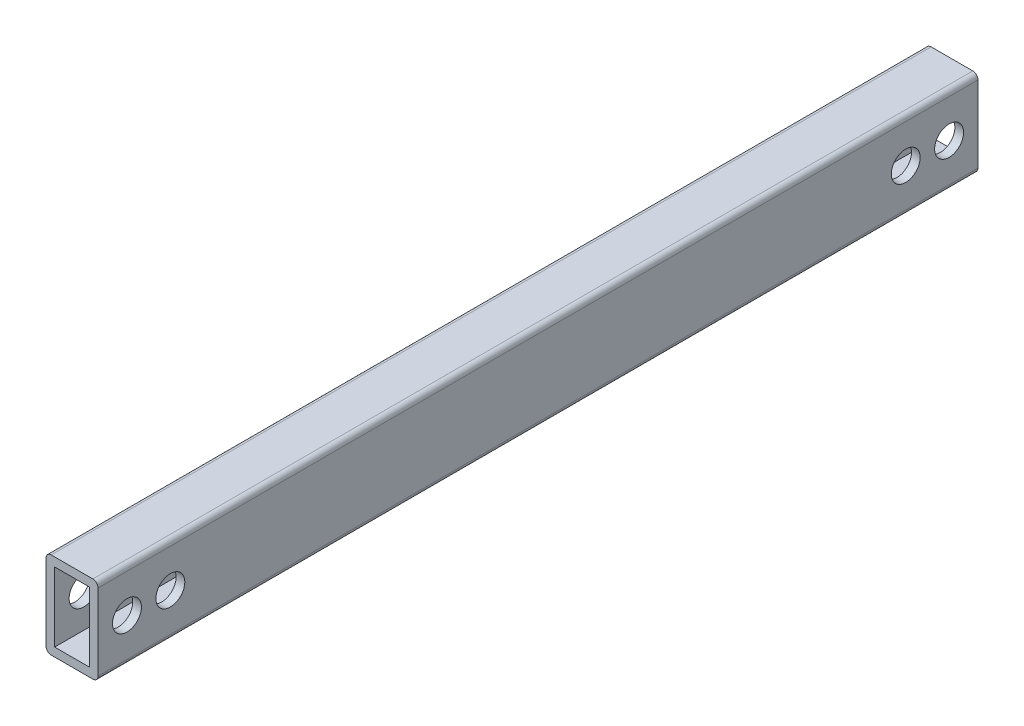
ISO-10303-21;
HEADER;
FILE_DESCRIPTION(('STEP AP214'),'2;1');
FILE_NAME('part.step','',(''),(''),'','','');
FILE_SCHEMA(('AUTOMOTIVE_DESIGN { 1 0 10303 214 1 1 1 1 }'));
ENDSEC;
DATA;
#1=APPLICATION_CONTEXT('core data for automotive mechanical design processes');
#2=APPLICATION_PROTOCOL_DEFINITION('international standard','automotive_design',2000,#1);
#3=PRODUCT_CONTEXT('',#1,'mechanical');
#4=PRODUCT('Part','Part','',(#3));
#5=PRODUCT_RELATED_PRODUCT_CATEGORY('part','',(#4));
#6=PRODUCT_DEFINITION_FORMATION('','',#4);
#7=PRODUCT_DEFINITION_CONTEXT('part definition',#1,'design');
#8=PRODUCT_DEFINITION('design','',#6,#7);
#9=PRODUCT_DEFINITION_SHAPE('','',#8);
#10=(LENGTH_UNIT() NAMED_UNIT(*) SI_UNIT(.MILLI.,.METRE.));
#11=(NAMED_UNIT(*) PLANE_ANGLE_UNIT() SI_UNIT($,.RADIAN.));
#12=(NAMED_UNIT(*) SI_UNIT($,.STERADIAN.) SOLID_ANGLE_UNIT());
#13=UNCERTAINTY_MEASURE_WITH_UNIT(LENGTH_MEASURE(1.E-05),#10,'distance_accuracy_value','');
#14=(GEOMETRIC_REPRESENTATION_CONTEXT(3) GLOBAL_UNCERTAINTY_ASSIGNED_CONTEXT((#13)) GLOBAL_UNIT_ASSIGNED_CONTEXT((#10,
#11,#12)) REPRESENTATION_CONTEXT('',''));
#15=CARTESIAN_POINT('',(0.,0.,0.));
#16=DIRECTION('',(0.,0.,1.));
#17=DIRECTION('',(1.,0.,0.));
#18=AXIS2_PLACEMENT_3D('',#15,#16,#17);
#19=CARTESIAN_POINT('',(0.,0.,304.31790468));
#20=DIRECTION('',(0.,0.,1.));
#21=DIRECTION('',(1.,0.,0.));
#22=AXIS2_PLACEMENT_3D('',#19,#20,#21);
#23=PLANE('',#22);
#24=DIRECTION('',(0.,-1.,0.));
#25=VECTOR('',#24,1.);
#26=CARTESIAN_POINT('',(-9.,-15.,304.31790468));
#27=LINE('',#26,#25);
#28=CARTESIAN_POINT('',(-9.,13.2,304.31790468));
#29=VERTEX_POINT('',#28);
#30=CARTESIAN_POINT('',(-9.,-13.2,304.31790468));
#31=VERTEX_POINT('',#30);
#32=EDGE_CURVE('E170',#29,#31,#27,.T.);
#33=ORIENTED_EDGE('',*,*,#32,.T.);
#34=CARTESIAN_POINT('',(-7.2,-13.2,304.31790468));
#35=DIRECTION('',(0.,0.,1.));
#36=DIRECTION('',(1.,0.,0.));
#37=AXIS2_PLACEMENT_3D('',#34,#35,#36);
#38=CIRCLE('',#37,1.8);
#39=CARTESIAN_POINT('',(-7.2,-15.,304.31790468));
#40=VERTEX_POINT('',#39);
#41=EDGE_CURVE('E229',#31,#40,#38,.T.);
#42=ORIENTED_EDGE('',*,*,#41,.T.);
#43=DIRECTION('',(1.,0.,0.));
#44=VECTOR('',#43,1.);
#45=CARTESIAN_POINT('',(9.,-15.,304.31790468));
#46=LINE('',#45,#44);
#47=CARTESIAN_POINT('',(7.2,-15.,304.31790468));
#48=VERTEX_POINT('',#47);
#49=EDGE_CURVE('E173',#40,#48,#46,.T.);
#50=ORIENTED_EDGE('',*,*,#49,.T.);
#51=CARTESIAN_POINT('',(7.2,-13.2,304.31790468));
#52=DIRECTION('',(0.,0.,1.));
#53=DIRECTION('',(1.,0.,0.));
#54=AXIS2_PLACEMENT_3D('',#51,#52,#53);
#55=CIRCLE('',#54,1.8);
#56=CARTESIAN_POINT('',(9.,-13.2,304.31790468));
#57=VERTEX_POINT('',#56);
#58=EDGE_CURVE('E227',#48,#57,#55,.T.);
#59=ORIENTED_EDGE('',*,*,#58,.T.);
#60=DIRECTION('',(0.,1.,0.));
#61=VECTOR('',#60,1.);
#62=CARTESIAN_POINT('',(9.,-15.,304.31790468));
#63=LINE('',#62,#61);
#64=CARTESIAN_POINT('',(9.,13.2,304.31790468));
#65=VERTEX_POINT('',#64);
#66=EDGE_CURVE('E177',#57,#65,#63,.T.);
#67=ORIENTED_EDGE('',*,*,#66,.T.);
#68=CARTESIAN_POINT('',(7.2,13.2,304.31790468));
#69=DIRECTION('',(0.,0.,1.));
#70=DIRECTION('',(1.,0.,0.));
#71=AXIS2_PLACEMENT_3D('',#68,#69,#70);
#72=CIRCLE('',#71,1.8);
#73=CARTESIAN_POINT('',(7.2,15.,304.31790468));
#74=VERTEX_POINT('',#73);
#75=EDGE_CURVE('E57',#65,#74,#72,.T.);
#76=ORIENTED_EDGE('',*,*,#75,.T.);
#77=DIRECTION('',(-1.,0.,0.));
#78=VECTOR('',#77,1.);
#79=CARTESIAN_POINT('',(9.,15.,304.31790468));
#80=LINE('',#79,#78);
#81=CARTESIAN_POINT('',(-7.2,15.,304.31790468));
#82=VERTEX_POINT('',#81);
#83=EDGE_CURVE('E179',#74,#82,#80,.T.);
#84=ORIENTED_EDGE('',*,*,#83,.T.);
#85=CARTESIAN_POINT('',(-7.2,13.2,304.31790468));
#86=DIRECTION('',(0.,0.,1.));
#87=DIRECTION('',(1.,0.,0.));
#88=AXIS2_PLACEMENT_3D('',#85,#86,#87);
#89=CIRCLE('',#88,1.8);
#90=EDGE_CURVE('E224',#82,#29,#89,.T.);
#91=ORIENTED_EDGE('',*,*,#90,.T.);
#92=EDGE_LOOP('',(#33,#42,#50,#59,#67,#76,#84,#91));
#93=FACE_BOUND('',#92,.T.);
#94=DIRECTION('',(1.,0.,0.));
#95=VECTOR('',#94,1.);
#96=CARTESIAN_POINT('',(6.,-12.,304.31790468));
#97=LINE('',#96,#95);
#98=CARTESIAN_POINT('',(-6.,-12.,304.31790468));
#99=VERTEX_POINT('',#98);
#100=CARTESIAN_POINT('',(6.,-12.,304.31790468));
#101=VERTEX_POINT('',#100);
#102=EDGE_CURVE('E137',#99,#101,#97,.T.);
#103=ORIENTED_EDGE('',*,*,#102,.F.);
#104=DIRECTION('',(0.,-1.,0.));
#105=VECTOR('',#104,1.);
#106=CARTESIAN_POINT('',(-6.,-12.,304.31790468));
#107=LINE('',#106,#105);
#108=CARTESIAN_POINT('',(-6.,12.,304.31790468));
#109=VERTEX_POINT('',#108);
#110=EDGE_CURVE('E127',#109,#99,#107,.T.);
#111=ORIENTED_EDGE('',*,*,#110,.F.);
#112=DIRECTION('',(-1.,0.,0.));
#113=VECTOR('',#112,1.);
#114=CARTESIAN_POINT('',(6.,12.,304.31790468));
#115=LINE('',#114,#113);
#116=CARTESIAN_POINT('',(6.,12.,304.31790468));
#117=VERTEX_POINT('',#116);
#118=EDGE_CURVE('E152',#117,#109,#115,.T.);
#119=ORIENTED_EDGE('',*,*,#118,.F.);
#120=DIRECTION('',(0.,1.,0.));
#121=VECTOR('',#120,1.);
#122=CARTESIAN_POINT('',(6.,-12.,304.31790468));
#123=LINE('',#122,#121);
#124=EDGE_CURVE('E150',#101,#117,#123,.T.);
#125=ORIENTED_EDGE('',*,*,#124,.F.);
#126=EDGE_LOOP('',(#103,#111,#119,#125));
#127=FACE_BOUND('',#126,.T.);
#128=ADVANCED_FACE('F36',(#93,#127),#23,.T.);
#129=CARTESIAN_POINT('',(0.,0.,0.));
#130=DIRECTION('',(0.,0.,1.));
#131=DIRECTION('',(1.,0.,0.));
#132=AXIS2_PLACEMENT_3D('',#129,#130,#131);
#133=PLANE('',#132);
#134=DIRECTION('',(1.,0.,0.));
#135=VECTOR('',#134,1.);
#136=CARTESIAN_POINT('',(9.,-15.,0.));
#137=LINE('',#136,#135);
#138=CARTESIAN_POINT('',(-7.2,-15.,0.));
#139=VERTEX_POINT('',#138);
#140=CARTESIAN_POINT('',(7.2,-15.,0.));
#141=VERTEX_POINT('',#140);
#142=EDGE_CURVE('E184',#139,#141,#137,.T.);
#143=ORIENTED_EDGE('',*,*,#142,.F.);
#144=CARTESIAN_POINT('',(-7.2,-13.2,0.));
#145=DIRECTION('',(0.,0.,1.));
#146=DIRECTION('',(1.,0.,0.));
#147=AXIS2_PLACEMENT_3D('',#144,#145,#146);
#148=CIRCLE('',#147,1.8);
#149=CARTESIAN_POINT('',(-9.,-13.2,0.));
#150=VERTEX_POINT('',#149);
#151=EDGE_CURVE('E217',#139,#150,#148,.F.);
#152=ORIENTED_EDGE('',*,*,#151,.T.);
#153=DIRECTION('',(0.,-1.,0.));
#154=VECTOR('',#153,1.);
#155=CARTESIAN_POINT('',(-9.,-15.,0.));
#156=LINE('',#155,#154);
#157=CARTESIAN_POINT('',(-9.,13.2,0.));
#158=VERTEX_POINT('',#157);
#159=EDGE_CURVE('E145',#158,#150,#156,.T.);
#160=ORIENTED_EDGE('',*,*,#159,.F.);
#161=CARTESIAN_POINT('',(-7.2,13.2,0.));
#162=DIRECTION('',(0.,0.,1.));
#163=DIRECTION('',(1.,0.,0.));
#164=AXIS2_PLACEMENT_3D('',#161,#162,#163);
#165=CIRCLE('',#164,1.8);
#166=CARTESIAN_POINT('',(-7.2,15.,0.));
#167=VERTEX_POINT('',#166);
#168=EDGE_CURVE('E211',#158,#167,#165,.F.);
#169=ORIENTED_EDGE('',*,*,#168,.T.);
#170=DIRECTION('',(-1.,0.,0.));
#171=VECTOR('',#170,1.);
#172=CARTESIAN_POINT('',(9.,15.,0.));
#173=LINE('',#172,#171);
#174=CARTESIAN_POINT('',(7.2,15.,0.));
#175=VERTEX_POINT('',#174);
#176=EDGE_CURVE('E174',#175,#167,#173,.T.);
#177=ORIENTED_EDGE('',*,*,#176,.F.);
#178=CARTESIAN_POINT('',(7.2,13.2,0.));
#179=DIRECTION('',(0.,0.,1.));
#180=DIRECTION('',(1.,0.,0.));
#181=AXIS2_PLACEMENT_3D('',#178,#179,#180);
#182=CIRCLE('',#181,1.8);
#183=CARTESIAN_POINT('',(9.,13.2,0.));
#184=VERTEX_POINT('',#183);
#185=EDGE_CURVE('E213',#175,#184,#182,.F.);
#186=ORIENTED_EDGE('',*,*,#185,.T.);
#187=DIRECTION('',(0.,1.,0.));
#188=VECTOR('',#187,1.);
#189=CARTESIAN_POINT('',(9.,-15.,0.));
#190=LINE('',#189,#188);
#191=CARTESIAN_POINT('',(9.,-13.2,0.));
#192=VERTEX_POINT('',#191);
#193=EDGE_CURVE('E187',#192,#184,#190,.T.);
#194=ORIENTED_EDGE('',*,*,#193,.F.);
#195=CARTESIAN_POINT('',(7.2,-13.2,0.));
#196=DIRECTION('',(0.,0.,1.));
#197=DIRECTION('',(1.,0.,0.));
#198=AXIS2_PLACEMENT_3D('',#195,#196,#197);
#199=CIRCLE('',#198,1.8);
#200=EDGE_CURVE('E215',#192,#141,#199,.F.);
#201=ORIENTED_EDGE('',*,*,#200,.T.);
#202=EDGE_LOOP('',(#143,#152,#160,#169,#177,#186,#194,#201));
#203=FACE_BOUND('',#202,.T.);
#204=DIRECTION('',(0.,-1.,0.));
#205=VECTOR('',#204,1.);
#206=CARTESIAN_POINT('',(-6.,-12.,0.));
#207=LINE('',#206,#205);
#208=CARTESIAN_POINT('',(-6.,12.,0.));
#209=VERTEX_POINT('',#208);
#210=CARTESIAN_POINT('',(-6.,-12.,0.));
#211=VERTEX_POINT('',#210);
#212=EDGE_CURVE('E157',#209,#211,#207,.T.);
#213=ORIENTED_EDGE('',*,*,#212,.T.);
#214=DIRECTION('',(1.,0.,0.));
#215=VECTOR('',#214,1.);
#216=CARTESIAN_POINT('',(6.,-12.,0.));
#217=LINE('',#216,#215);
#218=CARTESIAN_POINT('',(6.,-12.,0.));
#219=VERTEX_POINT('',#218);
#220=EDGE_CURVE('E144',#211,#219,#217,.T.);
#221=ORIENTED_EDGE('',*,*,#220,.T.);
#222=DIRECTION('',(0.,1.,0.));
#223=VECTOR('',#222,1.);
#224=CARTESIAN_POINT('',(6.,-12.,0.));
#225=LINE('',#224,#223);
#226=CARTESIAN_POINT('',(6.,12.,0.));
#227=VERTEX_POINT('',#226);
#228=EDGE_CURVE('E161',#219,#227,#225,.T.);
#229=ORIENTED_EDGE('',*,*,#228,.T.);
#230=DIRECTION('',(-1.,0.,0.));
#231=VECTOR('',#230,1.);
#232=CARTESIAN_POINT('',(6.,12.,0.));
#233=LINE('',#232,#231);
#234=EDGE_CURVE('E138',#227,#209,#233,.T.);
#235=ORIENTED_EDGE('',*,*,#234,.T.);
#236=EDGE_LOOP('',(#213,#221,#229,#235));
#237=FACE_BOUND('',#236,.T.);
#238=ADVANCED_FACE('F245',(#203,#237),#133,.F.);
#239=CARTESIAN_POINT('',(-9.,-15.,304.31790468));
#240=DIRECTION('',(1.,0.,0.));
#241=DIRECTION('',(0.,0.,-1.));
#242=AXIS2_PLACEMENT_3D('',#239,#240,#241);
#243=PLANE('',#242);
#244=CARTESIAN_POINT('',(-9.,0.,294.31790468));
#245=DIRECTION('',(1.,0.,0.));
#246=DIRECTION('',(0.,0.,-1.));
#247=AXIS2_PLACEMENT_3D('',#244,#245,#246);
#248=CIRCLE('',#247,4.99999999999999);
#249=CARTESIAN_POINT('',(-9.,0.,289.31790468));
#250=VERTEX_POINT('',#249);
#251=EDGE_CURVE('E195',#250,#250,#248,.T.);
#252=ORIENTED_EDGE('',*,*,#251,.T.);
#253=EDGE_LOOP('',(#252));
#254=FACE_BOUND('',#253,.T.);
#255=CARTESIAN_POINT('',(-9.,0.,279.31790468));
#256=DIRECTION('',(1.,0.,0.));
#257=DIRECTION('',(0.,0.,-1.));
#258=AXIS2_PLACEMENT_3D('',#255,#256,#257);
#259=CIRCLE('',#258,4.99999999999999);
#260=CARTESIAN_POINT('',(-9.,0.,274.31790468));
#261=VERTEX_POINT('',#260);
#262=EDGE_CURVE('E303',#261,#261,#259,.T.);
#263=ORIENTED_EDGE('',*,*,#262,.T.);
#264=EDGE_LOOP('',(#263));
#265=FACE_BOUND('',#264,.T.);
#266=CARTESIAN_POINT('',(-9.,0.,25.));
#267=DIRECTION('',(1.,0.,0.));
#268=DIRECTION('',(0.,0.,1.));
#269=AXIS2_PLACEMENT_3D('',#266,#267,#268);
#270=CIRCLE('',#269,4.99999999999999);
#271=CARTESIAN_POINT('',(-9.,0.,30.));
#272=VERTEX_POINT('',#271);
#273=EDGE_CURVE('E307',#272,#272,#270,.T.);
#274=ORIENTED_EDGE('',*,*,#273,.T.);
#275=EDGE_LOOP('',(#274));
#276=FACE_BOUND('',#275,.T.);
#277=CARTESIAN_POINT('',(-9.,0.,10.));
#278=DIRECTION('',(1.,0.,0.));
#279=DIRECTION('',(0.,0.,1.));
#280=AXIS2_PLACEMENT_3D('',#277,#278,#279);
#281=CIRCLE('',#280,4.99999999999999);
#282=CARTESIAN_POINT('',(-9.,0.,15.));
#283=VERTEX_POINT('',#282);
#284=EDGE_CURVE('E310',#283,#283,#281,.T.);
#285=ORIENTED_EDGE('',*,*,#284,.T.);
#286=EDGE_LOOP('',(#285));
#287=FACE_BOUND('',#286,.T.);
#288=ORIENTED_EDGE('',*,*,#159,.T.);
#289=DIRECTION('',(0.,0.,-1.));
#290=VECTOR('',#289,1.);
#291=CARTESIAN_POINT('',(-9.,-13.2,304.31790468));
#292=LINE('',#291,#290);
#293=EDGE_CURVE('E222',#150,#31,#292,.F.);
#294=ORIENTED_EDGE('',*,*,#293,.T.);
#295=ORIENTED_EDGE('',*,*,#32,.F.);
#296=DIRECTION('',(0.,0.,-1.));
#297=VECTOR('',#296,1.);
#298=CARTESIAN_POINT('',(-9.,13.2,304.31790468));
#299=LINE('',#298,#297);
#300=EDGE_CURVE('E219',#29,#158,#299,.T.);
#301=ORIENTED_EDGE('',*,*,#300,.T.);
#302=EDGE_LOOP('',(#288,#294,#295,#301));
#303=FACE_BOUND('',#302,.T.);
#304=ADVANCED_FACE('F258',(#254,#265,#276,#287,#303),#243,.F.);
#305=CARTESIAN_POINT('',(9.,-15.,304.31790468));
#306=DIRECTION('',(0.,1.,0.));
#307=DIRECTION('',(0.,0.,1.));
#308=AXIS2_PLACEMENT_3D('',#305,#306,#307);
#309=PLANE('',#308);
#310=ORIENTED_EDGE('',*,*,#49,.F.);
#311=DIRECTION('',(0.,0.,-1.));
#312=VECTOR('',#311,1.);
#313=CARTESIAN_POINT('',(-7.2,-15.,304.31790468));
#314=LINE('',#313,#312);
#315=EDGE_CURVE('E208',#40,#139,#314,.T.);
#316=ORIENTED_EDGE('',*,*,#315,.T.);
#317=ORIENTED_EDGE('',*,*,#142,.T.);
#318=DIRECTION('',(0.,0.,-1.));
#319=VECTOR('',#318,1.);
#320=CARTESIAN_POINT('',(7.2,-15.,304.31790468));
#321=LINE('',#320,#319);
#322=EDGE_CURVE('E181',#141,#48,#321,.F.);
#323=ORIENTED_EDGE('',*,*,#322,.T.);
#324=EDGE_LOOP('',(#310,#316,#317,#323));
#325=FACE_BOUND('',#324,.T.);
#326=ADVANCED_FACE('F266',(#325),#309,.F.);
#327=CARTESIAN_POINT('',(9.,-15.,304.31790468));
#328=DIRECTION('',(-1.,0.,0.));
#329=DIRECTION('',(0.,0.,1.));
#330=AXIS2_PLACEMENT_3D('',#327,#328,#329);
#331=PLANE('',#330);
#332=CARTESIAN_POINT('',(9.,0.,294.31790468));
#333=DIRECTION('',(1.,0.,0.));
#334=DIRECTION('',(0.,0.,-1.));
#335=AXIS2_PLACEMENT_3D('',#332,#333,#334);
#336=CIRCLE('',#335,4.99999999999999);
#337=CARTESIAN_POINT('',(9.,0.,289.31790468));
#338=VERTEX_POINT('',#337);
#339=EDGE_CURVE('E394',#338,#338,#336,.T.);
#340=ORIENTED_EDGE('',*,*,#339,.F.);
#341=EDGE_LOOP('',(#340));
#342=FACE_BOUND('',#341,.T.);
#343=CARTESIAN_POINT('',(9.,0.,279.31790468));
#344=DIRECTION('',(1.,0.,0.));
#345=DIRECTION('',(0.,0.,-1.));
#346=AXIS2_PLACEMENT_3D('',#343,#344,#345);
#347=CIRCLE('',#346,4.99999999999999);
#348=CARTESIAN_POINT('',(9.,0.,274.31790468));
#349=VERTEX_POINT('',#348);
#350=EDGE_CURVE('E389',#349,#349,#347,.T.);
#351=ORIENTED_EDGE('',*,*,#350,.F.);
#352=EDGE_LOOP('',(#351));
#353=FACE_BOUND('',#352,.T.);
#354=CARTESIAN_POINT('',(9.,0.,25.));
#355=DIRECTION('',(1.,0.,0.));
#356=DIRECTION('',(0.,0.,1.));
#357=AXIS2_PLACEMENT_3D('',#354,#355,#356);
#358=CIRCLE('',#357,4.99999999999999);
#359=CARTESIAN_POINT('',(9.,0.,30.));
#360=VERTEX_POINT('',#359);
#361=EDGE_CURVE('E386',#360,#360,#358,.T.);
#362=ORIENTED_EDGE('',*,*,#361,.F.);
#363=EDGE_LOOP('',(#362));
#364=FACE_BOUND('',#363,.T.);
#365=CARTESIAN_POINT('',(9.,0.,10.));
#366=DIRECTION('',(1.,0.,0.));
#367=DIRECTION('',(0.,0.,1.));
#368=AXIS2_PLACEMENT_3D('',#365,#366,#367);
#369=CIRCLE('',#368,4.99999999999999);
#370=CARTESIAN_POINT('',(9.,0.,15.));
#371=VERTEX_POINT('',#370);
#372=EDGE_CURVE('E312',#371,#371,#369,.T.);
#373=ORIENTED_EDGE('',*,*,#372,.F.);
#374=EDGE_LOOP('',(#373));
#375=FACE_BOUND('',#374,.T.);
#376=ORIENTED_EDGE('',*,*,#66,.F.);
#377=DIRECTION('',(0.,0.,-1.));
#378=VECTOR('',#377,1.);
#379=CARTESIAN_POINT('',(9.,-13.2,304.31790468));
#380=LINE('',#379,#378);
#381=EDGE_CURVE('E233',#57,#192,#380,.T.);
#382=ORIENTED_EDGE('',*,*,#381,.T.);
#383=ORIENTED_EDGE('',*,*,#193,.T.);
#384=DIRECTION('',(0.,0.,-1.));
#385=VECTOR('',#384,1.);
#386=CARTESIAN_POINT('',(9.,13.2,304.31790468));
#387=LINE('',#386,#385);
#388=EDGE_CURVE('E231',#184,#65,#387,.F.);
#389=ORIENTED_EDGE('',*,*,#388,.T.);
#390=EDGE_LOOP('',(#376,#382,#383,#389));
#391=FACE_BOUND('',#390,.T.);
#392=ADVANCED_FACE('F239',(#342,#353,#364,#375,#391),#331,.F.);
#393=CARTESIAN_POINT('',(9.,15.,304.31790468));
#394=DIRECTION('',(0.,-1.,0.));
#395=DIRECTION('',(0.,0.,-1.));
#396=AXIS2_PLACEMENT_3D('',#393,#394,#395);
#397=PLANE('',#396);
#398=ORIENTED_EDGE('',*,*,#83,.F.);
#399=DIRECTION('',(0.,0.,-1.));
#400=VECTOR('',#399,1.);
#401=CARTESIAN_POINT('',(7.2,15.,304.31790468));
#402=LINE('',#401,#400);
#403=EDGE_CURVE('E11',#74,#175,#402,.T.);
#404=ORIENTED_EDGE('',*,*,#403,.T.);
#405=ORIENTED_EDGE('',*,*,#176,.T.);
#406=DIRECTION('',(0.,0.,-1.));
#407=VECTOR('',#406,1.);
#408=CARTESIAN_POINT('',(-7.2,15.,304.31790468));
#409=LINE('',#408,#407);
#410=EDGE_CURVE('E44',#167,#82,#409,.F.);
#411=ORIENTED_EDGE('',*,*,#410,.T.);
#412=EDGE_LOOP('',(#398,#404,#405,#411));
#413=FACE_BOUND('',#412,.T.);
#414=ADVANCED_FACE('F251',(#413),#397,.F.);
#415=CARTESIAN_POINT('',(-6.,-12.,304.31790468));
#416=DIRECTION('',(1.,0.,0.));
#417=DIRECTION('',(0.,0.,-1.));
#418=AXIS2_PLACEMENT_3D('',#415,#416,#417);
#419=PLANE('',#418);
#420=CARTESIAN_POINT('',(-6.,0.,294.31790468));
#421=DIRECTION('',(1.,0.,0.));
#422=DIRECTION('',(0.,0.,-1.));
#423=AXIS2_PLACEMENT_3D('',#420,#421,#422);
#424=CIRCLE('',#423,4.99999999999999);
#425=CARTESIAN_POINT('',(-6.,0.,289.31790468));
#426=VERTEX_POINT('',#425);
#427=EDGE_CURVE('E159',#426,#426,#424,.T.);
#428=ORIENTED_EDGE('',*,*,#427,.F.);
#429=EDGE_LOOP('',(#428));
#430=FACE_BOUND('',#429,.T.);
#431=CARTESIAN_POINT('',(-6.,0.,279.31790468));
#432=DIRECTION('',(1.,0.,0.));
#433=DIRECTION('',(0.,0.,-1.));
#434=AXIS2_PLACEMENT_3D('',#431,#432,#433);
#435=CIRCLE('',#434,4.99999999999999);
#436=CARTESIAN_POINT('',(-6.,0.,274.31790468));
#437=VERTEX_POINT('',#436);
#438=EDGE_CURVE('E203',#437,#437,#435,.T.);
#439=ORIENTED_EDGE('',*,*,#438,.F.);
#440=EDGE_LOOP('',(#439));
#441=FACE_BOUND('',#440,.T.);
#442=CARTESIAN_POINT('',(-6.,0.,25.));
#443=DIRECTION('',(1.,0.,0.));
#444=DIRECTION('',(0.,0.,-1.));
#445=AXIS2_PLACEMENT_3D('',#442,#443,#444);
#446=CIRCLE('',#445,4.99999999999999);
#447=CARTESIAN_POINT('',(-6.,0.,20.));
#448=VERTEX_POINT('',#447);
#449=EDGE_CURVE('E199',#448,#448,#446,.T.);
#450=ORIENTED_EDGE('',*,*,#449,.F.);
#451=EDGE_LOOP('',(#450));
#452=FACE_BOUND('',#451,.T.);
#453=CARTESIAN_POINT('',(-6.,0.,10.));
#454=DIRECTION('',(1.,0.,0.));
#455=DIRECTION('',(0.,0.,-1.));
#456=AXIS2_PLACEMENT_3D('',#453,#454,#455);
#457=CIRCLE('',#456,4.99999999999999);
#458=CARTESIAN_POINT('',(-6.,0.,5.00000000000002));
#459=VERTEX_POINT('',#458);
#460=EDGE_CURVE('E194',#459,#459,#457,.T.);
#461=ORIENTED_EDGE('',*,*,#460,.F.);
#462=EDGE_LOOP('',(#461));
#463=FACE_BOUND('',#462,.T.);
#464=ORIENTED_EDGE('',*,*,#212,.F.);
#465=DIRECTION('',(0.,0.,-1.));
#466=VECTOR('',#465,1.);
#467=CARTESIAN_POINT('',(-6.,12.,304.31790468));
#468=LINE('',#467,#466);
#469=EDGE_CURVE('E133',#109,#209,#468,.T.);
#470=ORIENTED_EDGE('',*,*,#469,.F.);
#471=ORIENTED_EDGE('',*,*,#110,.T.);
#472=DIRECTION('',(0.,0.,-1.));
#473=VECTOR('',#472,1.);
#474=CARTESIAN_POINT('',(-6.,-12.,304.31790468));
#475=LINE('',#474,#473);
#476=EDGE_CURVE('E130',#99,#211,#475,.T.);
#477=ORIENTED_EDGE('',*,*,#476,.T.);
#478=EDGE_LOOP('',(#464,#470,#471,#477));
#479=FACE_BOUND('',#478,.T.);
#480=ADVANCED_FACE('F129',(#430,#441,#452,#463,#479),#419,.T.);
#481=CARTESIAN_POINT('',(6.,-12.,304.31790468));
#482=DIRECTION('',(0.,1.,0.));
#483=DIRECTION('',(0.,0.,1.));
#484=AXIS2_PLACEMENT_3D('',#481,#482,#483);
#485=PLANE('',#484);
#486=ORIENTED_EDGE('',*,*,#220,.F.);
#487=ORIENTED_EDGE('',*,*,#476,.F.);
#488=ORIENTED_EDGE('',*,*,#102,.T.);
#489=DIRECTION('',(0.,0.,-1.));
#490=VECTOR('',#489,1.);
#491=CARTESIAN_POINT('',(6.,-12.,304.31790468));
#492=LINE('',#491,#490);
#493=EDGE_CURVE('E146',#101,#219,#492,.T.);
#494=ORIENTED_EDGE('',*,*,#493,.T.);
#495=EDGE_LOOP('',(#486,#487,#488,#494));
#496=FACE_BOUND('',#495,.T.);
#497=ADVANCED_FACE('F141',(#496),#485,.T.);
#498=CARTESIAN_POINT('',(6.,-12.,304.31790468));
#499=DIRECTION('',(-1.,0.,0.));
#500=DIRECTION('',(0.,0.,1.));
#501=AXIS2_PLACEMENT_3D('',#498,#499,#500);
#502=PLANE('',#501);
#503=CARTESIAN_POINT('',(6.,0.,294.31790468));
#504=DIRECTION('',(-1.,0.,0.));
#505=DIRECTION('',(0.,0.,1.));
#506=AXIS2_PLACEMENT_3D('',#503,#504,#505);
#507=CIRCLE('',#506,4.99999999999999);
#508=CARTESIAN_POINT('',(6.,0.,299.31790468));
#509=VERTEX_POINT('',#508);
#510=EDGE_CURVE('E204',#509,#509,#507,.T.);
#511=ORIENTED_EDGE('',*,*,#510,.F.);
#512=EDGE_LOOP('',(#511));
#513=FACE_BOUND('',#512,.T.);
#514=CARTESIAN_POINT('',(6.,0.,279.31790468));
#515=DIRECTION('',(-1.,0.,0.));
#516=DIRECTION('',(0.,0.,1.));
#517=AXIS2_PLACEMENT_3D('',#514,#515,#516);
#518=CIRCLE('',#517,4.99999999999999);
#519=CARTESIAN_POINT('',(6.,0.,284.31790468));
#520=VERTEX_POINT('',#519);
#521=EDGE_CURVE('E200',#520,#520,#518,.T.);
#522=ORIENTED_EDGE('',*,*,#521,.F.);
#523=EDGE_LOOP('',(#522));
#524=FACE_BOUND('',#523,.T.);
#525=CARTESIAN_POINT('',(6.,0.,25.));
#526=DIRECTION('',(-1.,0.,0.));
#527=DIRECTION('',(0.,0.,1.));
#528=AXIS2_PLACEMENT_3D('',#525,#526,#527);
#529=CIRCLE('',#528,4.99999999999999);
#530=CARTESIAN_POINT('',(6.,0.,30.));
#531=VERTEX_POINT('',#530);
#532=EDGE_CURVE('E196',#531,#531,#529,.T.);
#533=ORIENTED_EDGE('',*,*,#532,.F.);
#534=EDGE_LOOP('',(#533));
#535=FACE_BOUND('',#534,.T.);
#536=CARTESIAN_POINT('',(6.,0.,10.));
#537=DIRECTION('',(-1.,0.,0.));
#538=DIRECTION('',(0.,0.,1.));
#539=AXIS2_PLACEMENT_3D('',#536,#537,#538);
#540=CIRCLE('',#539,4.99999999999999);
#541=CARTESIAN_POINT('',(6.,0.,15.));
#542=VERTEX_POINT('',#541);
#543=EDGE_CURVE('E191',#542,#542,#540,.T.);
#544=ORIENTED_EDGE('',*,*,#543,.F.);
#545=EDGE_LOOP('',(#544));
#546=FACE_BOUND('',#545,.T.);
#547=ORIENTED_EDGE('',*,*,#228,.F.);
#548=ORIENTED_EDGE('',*,*,#493,.F.);
#549=ORIENTED_EDGE('',*,*,#124,.T.);
#550=DIRECTION('',(0.,0.,-1.));
#551=VECTOR('',#550,1.);
#552=CARTESIAN_POINT('',(6.,12.,304.31790468));
#553=LINE('',#552,#551);
#554=EDGE_CURVE('E167',#117,#227,#553,.T.);
#555=ORIENTED_EDGE('',*,*,#554,.T.);
#556=EDGE_LOOP('',(#547,#548,#549,#555));
#557=FACE_BOUND('',#556,.T.);
#558=ADVANCED_FACE('F362',(#513,#524,#535,#546,#557),#502,.T.);
#559=CARTESIAN_POINT('',(6.,12.,304.31790468));
#560=DIRECTION('',(0.,-1.,0.));
#561=DIRECTION('',(0.,0.,-1.));
#562=AXIS2_PLACEMENT_3D('',#559,#560,#561);
#563=PLANE('',#562);
#564=ORIENTED_EDGE('',*,*,#234,.F.);
#565=ORIENTED_EDGE('',*,*,#554,.F.);
#566=ORIENTED_EDGE('',*,*,#118,.T.);
#567=ORIENTED_EDGE('',*,*,#469,.T.);
#568=EDGE_LOOP('',(#564,#565,#566,#567));
#569=FACE_BOUND('',#568,.T.);
#570=ADVANCED_FACE('F355',(#569),#563,.T.);
#571=CARTESIAN_POINT('',(-9.,0.,10.));
#572=DIRECTION('',(1.,0.,0.));
#573=DIRECTION('',(0.,0.,-1.));
#574=AXIS2_PLACEMENT_3D('',#571,#572,#573);
#575=CYLINDRICAL_SURFACE('',#574,4.99999999999999);
#576=ORIENTED_EDGE('',*,*,#543,.T.);
#577=EDGE_LOOP('',(#576));
#578=FACE_BOUND('',#577,.T.);
#579=ORIENTED_EDGE('',*,*,#372,.T.);
#580=EDGE_LOOP('',(#579));
#581=FACE_BOUND('',#580,.T.);
#582=ADVANCED_FACE('F341',(#578,#581),#575,.F.);
#583=CARTESIAN_POINT('',(-9.,0.,25.));
#584=DIRECTION('',(1.,0.,0.));
#585=DIRECTION('',(0.,0.,-1.));
#586=AXIS2_PLACEMENT_3D('',#583,#584,#585);
#587=CYLINDRICAL_SURFACE('',#586,4.99999999999999);
#588=ORIENTED_EDGE('',*,*,#532,.T.);
#589=EDGE_LOOP('',(#588));
#590=FACE_BOUND('',#589,.T.);
#591=ORIENTED_EDGE('',*,*,#361,.T.);
#592=EDGE_LOOP('',(#591));
#593=FACE_BOUND('',#592,.T.);
#594=ADVANCED_FACE('F349',(#590,#593),#587,.F.);
#595=CARTESIAN_POINT('',(-9.,0.,279.31790468));
#596=DIRECTION('',(1.,0.,0.));
#597=DIRECTION('',(0.,0.,-1.));
#598=AXIS2_PLACEMENT_3D('',#595,#596,#597);
#599=CYLINDRICAL_SURFACE('',#598,4.99999999999999);
#600=ORIENTED_EDGE('',*,*,#521,.T.);
#601=EDGE_LOOP('',(#600));
#602=FACE_BOUND('',#601,.T.);
#603=ORIENTED_EDGE('',*,*,#350,.T.);
#604=EDGE_LOOP('',(#603));
#605=FACE_BOUND('',#604,.T.);
#606=ADVANCED_FACE('F350',(#602,#605),#599,.F.);
#607=CARTESIAN_POINT('',(-9.,0.,294.31790468));
#608=DIRECTION('',(1.,0.,0.));
#609=DIRECTION('',(0.,0.,-1.));
#610=AXIS2_PLACEMENT_3D('',#607,#608,#609);
#611=CYLINDRICAL_SURFACE('',#610,4.99999999999999);
#612=ORIENTED_EDGE('',*,*,#510,.T.);
#613=EDGE_LOOP('',(#612));
#614=FACE_BOUND('',#613,.T.);
#615=ORIENTED_EDGE('',*,*,#339,.T.);
#616=EDGE_LOOP('',(#615));
#617=FACE_BOUND('',#616,.T.);
#618=ADVANCED_FACE('F339',(#614,#617),#611,.F.);
#619=ORIENTED_EDGE('',*,*,#460,.T.);
#620=EDGE_LOOP('',(#619));
#621=FACE_BOUND('',#620,.T.);
#622=ORIENTED_EDGE('',*,*,#284,.F.);
#623=EDGE_LOOP('',(#622));
#624=FACE_BOUND('',#623,.T.);
#625=ADVANCED_FACE('F336',(#621,#624),#575,.F.);
#626=ORIENTED_EDGE('',*,*,#449,.T.);
#627=EDGE_LOOP('',(#626));
#628=FACE_BOUND('',#627,.T.);
#629=ORIENTED_EDGE('',*,*,#273,.F.);
#630=EDGE_LOOP('',(#629));
#631=FACE_BOUND('',#630,.T.);
#632=ADVANCED_FACE('F338',(#628,#631),#587,.F.);
#633=ORIENTED_EDGE('',*,*,#438,.T.);
#634=EDGE_LOOP('',(#633));
#635=FACE_BOUND('',#634,.T.);
#636=ORIENTED_EDGE('',*,*,#262,.F.);
#637=EDGE_LOOP('',(#636));
#638=FACE_BOUND('',#637,.T.);
#639=ADVANCED_FACE('F346',(#635,#638),#599,.F.);
#640=ORIENTED_EDGE('',*,*,#427,.T.);
#641=EDGE_LOOP('',(#640));
#642=FACE_BOUND('',#641,.T.);
#643=ORIENTED_EDGE('',*,*,#251,.F.);
#644=EDGE_LOOP('',(#643));
#645=FACE_BOUND('',#644,.T.);
#646=ADVANCED_FACE('F275',(#642,#645),#611,.F.);
#647=CARTESIAN_POINT('',(-7.2,-13.2,304.31790468));
#648=DIRECTION('',(0.,0.,-1.));
#649=DIRECTION('',(-1.,0.,0.));
#650=AXIS2_PLACEMENT_3D('',#647,#648,#649);
#651=CYLINDRICAL_SURFACE('',#650,1.8);
#652=ORIENTED_EDGE('',*,*,#41,.F.);
#653=ORIENTED_EDGE('',*,*,#293,.F.);
#654=ORIENTED_EDGE('',*,*,#151,.F.);
#655=ORIENTED_EDGE('',*,*,#315,.F.);
#656=EDGE_LOOP('',(#652,#653,#654,#655));
#657=FACE_BOUND('',#656,.T.);
#658=ADVANCED_FACE('F263',(#657),#651,.T.);
#659=CARTESIAN_POINT('',(7.2,-13.2,304.31790468));
#660=DIRECTION('',(0.,0.,-1.));
#661=DIRECTION('',(-1.,0.,0.));
#662=AXIS2_PLACEMENT_3D('',#659,#660,#661);
#663=CYLINDRICAL_SURFACE('',#662,1.8);
#664=ORIENTED_EDGE('',*,*,#58,.F.);
#665=ORIENTED_EDGE('',*,*,#322,.F.);
#666=ORIENTED_EDGE('',*,*,#200,.F.);
#667=ORIENTED_EDGE('',*,*,#381,.F.);
#668=EDGE_LOOP('',(#664,#665,#666,#667));
#669=FACE_BOUND('',#668,.T.);
#670=ADVANCED_FACE('F268',(#669),#663,.T.);
#671=CARTESIAN_POINT('',(7.2,13.2,304.31790468));
#672=DIRECTION('',(0.,0.,-1.));
#673=DIRECTION('',(-1.,0.,0.));
#674=AXIS2_PLACEMENT_3D('',#671,#672,#673);
#675=CYLINDRICAL_SURFACE('',#674,1.8);
#676=ORIENTED_EDGE('',*,*,#75,.F.);
#677=ORIENTED_EDGE('',*,*,#388,.F.);
#678=ORIENTED_EDGE('',*,*,#185,.F.);
#679=ORIENTED_EDGE('',*,*,#403,.F.);
#680=EDGE_LOOP('',(#676,#677,#678,#679));
#681=FACE_BOUND('',#680,.T.);
#682=ADVANCED_FACE('F250',(#681),#675,.T.);
#683=CARTESIAN_POINT('',(-7.2,13.2,304.31790468));
#684=DIRECTION('',(0.,0.,-1.));
#685=DIRECTION('',(-1.,0.,0.));
#686=AXIS2_PLACEMENT_3D('',#683,#684,#685);
#687=CYLINDRICAL_SURFACE('',#686,1.8);
#688=ORIENTED_EDGE('',*,*,#90,.F.);
#689=ORIENTED_EDGE('',*,*,#410,.F.);
#690=ORIENTED_EDGE('',*,*,#168,.F.);
#691=ORIENTED_EDGE('',*,*,#300,.F.);
#692=EDGE_LOOP('',(#688,#689,#690,#691));
#693=FACE_BOUND('',#692,.T.);
#694=ADVANCED_FACE('F38',(#693),#687,.T.);
#695=CLOSED_SHELL('',(#128,#238,#304,#326,#392,#414,#480,#497,#558,#570,#582,#594,#606,#618,
#625,#632,#639,#646,#658,#670,#682,#694));
#696=MANIFOLD_SOLID_BREP('B2',#695);
#697=ADVANCED_BREP_SHAPE_REPRESENTATION('',(#18,#696),#14);
#698=SHAPE_DEFINITION_REPRESENTATION(#9,#697);
ENDSEC;
END-ISO-10303-21;
